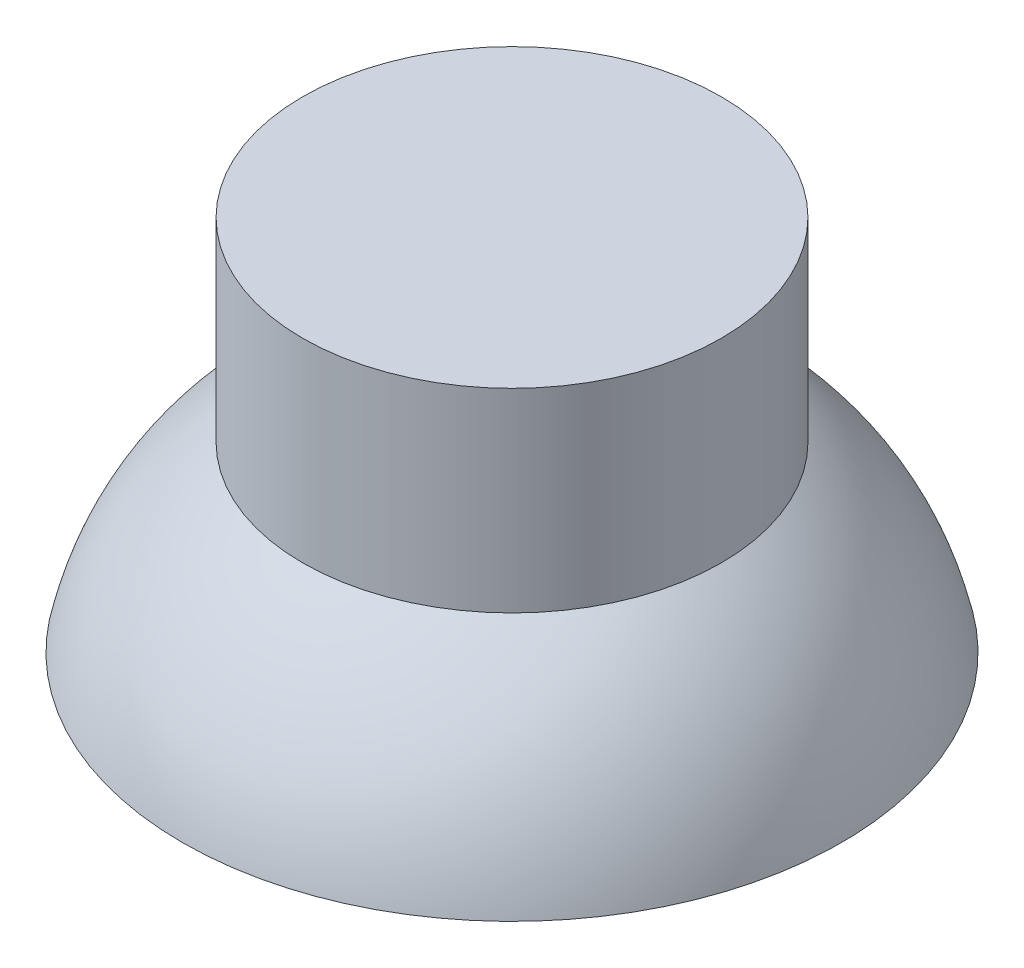
ISO-10303-21;
HEADER;
FILE_DESCRIPTION(('STEP AP214'),'2;1');
FILE_NAME('part.step','',(''),(''),'','','');
FILE_SCHEMA(('AUTOMOTIVE_DESIGN { 1 0 10303 214 1 1 1 1 }'));
ENDSEC;
DATA;
#1=APPLICATION_CONTEXT('core data for automotive mechanical design processes');
#2=APPLICATION_PROTOCOL_DEFINITION('international standard','automotive_design',2000,#1);
#3=PRODUCT_CONTEXT('',#1,'mechanical');
#4=PRODUCT('Part','Part','',(#3));
#5=PRODUCT_RELATED_PRODUCT_CATEGORY('part','',(#4));
#6=PRODUCT_DEFINITION_FORMATION('','',#4);
#7=PRODUCT_DEFINITION_CONTEXT('part definition',#1,'design');
#8=PRODUCT_DEFINITION('design','',#6,#7);
#9=PRODUCT_DEFINITION_SHAPE('','',#8);
#10=(LENGTH_UNIT() NAMED_UNIT(*) SI_UNIT(.MILLI.,.METRE.));
#11=(NAMED_UNIT(*) PLANE_ANGLE_UNIT() SI_UNIT($,.RADIAN.));
#12=(NAMED_UNIT(*) SI_UNIT($,.STERADIAN.) SOLID_ANGLE_UNIT());
#13=UNCERTAINTY_MEASURE_WITH_UNIT(LENGTH_MEASURE(1.E-05),#10,'distance_accuracy_value','');
#14=(GEOMETRIC_REPRESENTATION_CONTEXT(3) GLOBAL_UNCERTAINTY_ASSIGNED_CONTEXT((#13)) GLOBAL_UNIT_ASSIGNED_CONTEXT((#10,
#11,#12)) REPRESENTATION_CONTEXT('',''));
#15=CARTESIAN_POINT('',(0.,0.,0.));
#16=DIRECTION('',(0.,0.,1.));
#17=DIRECTION('',(1.,0.,0.));
#18=AXIS2_PLACEMENT_3D('',#15,#16,#17);
#19=CARTESIAN_POINT('',(0.,0.,0.));
#20=DIRECTION('',(0.,1.,0.));
#21=DIRECTION('',(0.,0.,1.));
#22=AXIS2_PLACEMENT_3D('',#19,#20,#21);
#23=CYLINDRICAL_SURFACE('',#22,5.25);
#24=CARTESIAN_POINT('',(0.,-2.6481593822325,0.));
#25=DIRECTION('',(0.,1.,0.));
#26=DIRECTION('',(0.,0.,1.));
#27=AXIS2_PLACEMENT_3D('',#24,#25,#26);
#28=CIRCLE('',#27,5.25);
#29=CARTESIAN_POINT('',(0.,-2.6481593822325,5.25));
#30=VERTEX_POINT('',#29);
#31=EDGE_CURVE('E10',#30,#30,#28,.T.);
#32=ORIENTED_EDGE('',*,*,#31,.T.);
#33=EDGE_LOOP('',(#32));
#34=FACE_BOUND('',#33,.T.);
#35=CARTESIAN_POINT('',(0.,2.23208369818026,0.));
#36=DIRECTION('',(0.,1.,0.));
#37=DIRECTION('',(0.,0.,1.));
#38=AXIS2_PLACEMENT_3D('',#35,#36,#37);
#39=CIRCLE('',#38,5.25);
#40=CARTESIAN_POINT('',(0.,2.23208369818026,5.25));
#41=VERTEX_POINT('',#40);
#42=EDGE_CURVE('E64',#41,#41,#39,.T.);
#43=ORIENTED_EDGE('',*,*,#42,.F.);
#44=EDGE_LOOP('',(#43));
#45=FACE_BOUND('',#44,.T.);
#46=ADVANCED_FACE('F37',(#34,#45),#23,.T.);
#47=CARTESIAN_POINT('',(-5.25,-2.6481593822325,0.));
#48=CARTESIAN_POINT('',(-7.63264976950372,-4.35657152105497,0.));
#49=CARTESIAN_POINT('',(-8.26767178826088,-7.21575679903237,0.));
#50=B_SPLINE_CURVE_WITH_KNOTS('',2,(#47,#48,#49),.UNSPECIFIED.,.F.,.F.,(3,3),(0.,1.),.UNSPECIFIED.);
#51=CARTESIAN_POINT('',(0.,0.,0.));
#52=DIRECTION('',(0.,1.,0.));
#53=AXIS1_PLACEMENT('',#51,#52);
#54=SURFACE_OF_REVOLUTION('',#50,#53);
#55=CARTESIAN_POINT('',(0.,-7.21575679903237,0.));
#56=DIRECTION('',(0.,1.,0.));
#57=DIRECTION('',(0.,0.,1.));
#58=AXIS2_PLACEMENT_3D('',#55,#56,#57);
#59=CIRCLE('',#58,8.26767178826088);
#60=CARTESIAN_POINT('',(0.,-7.21575679903237,8.26767178826088));
#61=VERTEX_POINT('',#60);
#62=EDGE_CURVE('E44',#61,#61,#59,.T.);
#63=ORIENTED_EDGE('',*,*,#62,.T.);
#64=EDGE_LOOP('',(#63));
#65=FACE_BOUND('',#64,.T.);
#66=ORIENTED_EDGE('',*,*,#31,.F.);
#67=EDGE_LOOP('',(#66));
#68=FACE_BOUND('',#67,.T.);
#69=ADVANCED_FACE('F86',(#65,#68),#54,.F.);
#70=CARTESIAN_POINT('',(-7.,-7.21575679903237,0.));
#71=DIRECTION('',(0.,-1.,0.));
#72=DIRECTION('',(0.,0.,-1.));
#73=AXIS2_PLACEMENT_3D('',#70,#71,#72);
#74=PLANE('',#73);
#75=CARTESIAN_POINT('',(0.,-7.21575679903237,0.));
#76=DIRECTION('',(0.,1.,0.));
#77=DIRECTION('',(0.,0.,1.));
#78=AXIS2_PLACEMENT_3D('',#75,#76,#77);
#79=CIRCLE('',#78,7.);
#80=CARTESIAN_POINT('',(0.,-7.21575679903237,7.));
#81=VERTEX_POINT('',#80);
#82=EDGE_CURVE('E49',#81,#81,#79,.T.);
#83=ORIENTED_EDGE('',*,*,#82,.T.);
#84=EDGE_LOOP('',(#83));
#85=FACE_BOUND('',#84,.T.);
#86=ORIENTED_EDGE('',*,*,#62,.F.);
#87=EDGE_LOOP('',(#86));
#88=FACE_BOUND('',#87,.T.);
#89=ADVANCED_FACE('F82',(#85,#88),#74,.T.);
#90=CARTESIAN_POINT('',(-7.,-7.21575679903237,0.));
#91=CARTESIAN_POINT('',(-6.51843410327274,-4.58472243577036,0.));
#92=CARTESIAN_POINT('',(-4.25,-3.11791630181974,0.));
#93=B_SPLINE_CURVE_WITH_KNOTS('',2,(#90,#91,#92),.UNSPECIFIED.,.F.,.F.,(3,3),(0.,1.),.UNSPECIFIED.);
#94=CARTESIAN_POINT('',(0.,0.,0.));
#95=DIRECTION('',(0.,1.,0.));
#96=AXIS1_PLACEMENT('',#94,#95);
#97=SURFACE_OF_REVOLUTION('',#93,#96);
#98=CARTESIAN_POINT('',(0.,-3.11791630181974,0.));
#99=DIRECTION('',(0.,1.,0.));
#100=DIRECTION('',(0.,0.,1.));
#101=AXIS2_PLACEMENT_3D('',#98,#99,#100);
#102=CIRCLE('',#101,4.25);
#103=CARTESIAN_POINT('',(0.,-3.11791630181974,4.25));
#104=VERTEX_POINT('',#103);
#105=EDGE_CURVE('E54',#104,#104,#102,.T.);
#106=ORIENTED_EDGE('',*,*,#105,.T.);
#107=EDGE_LOOP('',(#106));
#108=FACE_BOUND('',#107,.T.);
#109=ORIENTED_EDGE('',*,*,#82,.F.);
#110=EDGE_LOOP('',(#109));
#111=FACE_BOUND('',#110,.T.);
#112=ADVANCED_FACE('F77',(#108,#111),#97,.F.);
#113=CARTESIAN_POINT('',(0.,0.,0.));
#114=DIRECTION('',(0.,1.,0.));
#115=DIRECTION('',(0.,0.,1.));
#116=AXIS2_PLACEMENT_3D('',#113,#114,#115);
#117=CYLINDRICAL_SURFACE('',#116,4.25);
#118=CARTESIAN_POINT('',(0.,1.23208369818026,0.));
#119=DIRECTION('',(0.,1.,0.));
#120=DIRECTION('',(0.,0.,1.));
#121=AXIS2_PLACEMENT_3D('',#118,#119,#120);
#122=CIRCLE('',#121,4.25);
#123=CARTESIAN_POINT('',(0.,1.23208369818026,4.25));
#124=VERTEX_POINT('',#123);
#125=EDGE_CURVE('E60',#124,#124,#122,.T.);
#126=ORIENTED_EDGE('',*,*,#125,.T.);
#127=EDGE_LOOP('',(#126));
#128=FACE_BOUND('',#127,.T.);
#129=ORIENTED_EDGE('',*,*,#105,.F.);
#130=EDGE_LOOP('',(#129));
#131=FACE_BOUND('',#130,.T.);
#132=ADVANCED_FACE('F81',(#128,#131),#117,.F.);
#133=CARTESIAN_POINT('',(0.,1.23208369818026,0.));
#134=DIRECTION('',(0.,1.,0.));
#135=DIRECTION('',(0.,0.,1.));
#136=AXIS2_PLACEMENT_3D('',#133,#134,#135);
#137=PLANE('',#136);
#138=ORIENTED_EDGE('',*,*,#125,.F.);
#139=EDGE_LOOP('',(#138));
#140=FACE_BOUND('',#139,.T.);
#141=ADVANCED_FACE('F102',(#140),#137,.F.);
#142=CARTESIAN_POINT('',(0.,2.23208369818026,0.));
#143=DIRECTION('',(0.,1.,0.));
#144=DIRECTION('',(0.,0.,1.));
#145=AXIS2_PLACEMENT_3D('',#142,#143,#144);
#146=PLANE('',#145);
#147=ORIENTED_EDGE('',*,*,#42,.T.);
#148=EDGE_LOOP('',(#147));
#149=FACE_BOUND('',#148,.T.);
#150=ADVANCED_FACE('F100',(#149),#146,.T.);
#151=CLOSED_SHELL('',(#46,#69,#89,#112,#132,#141,#150));
#152=MANIFOLD_SOLID_BREP('B2',#151);
#153=ADVANCED_BREP_SHAPE_REPRESENTATION('',(#18,#152),#14);
#154=SHAPE_DEFINITION_REPRESENTATION(#9,#153);
ENDSEC;
END-ISO-10303-21;
